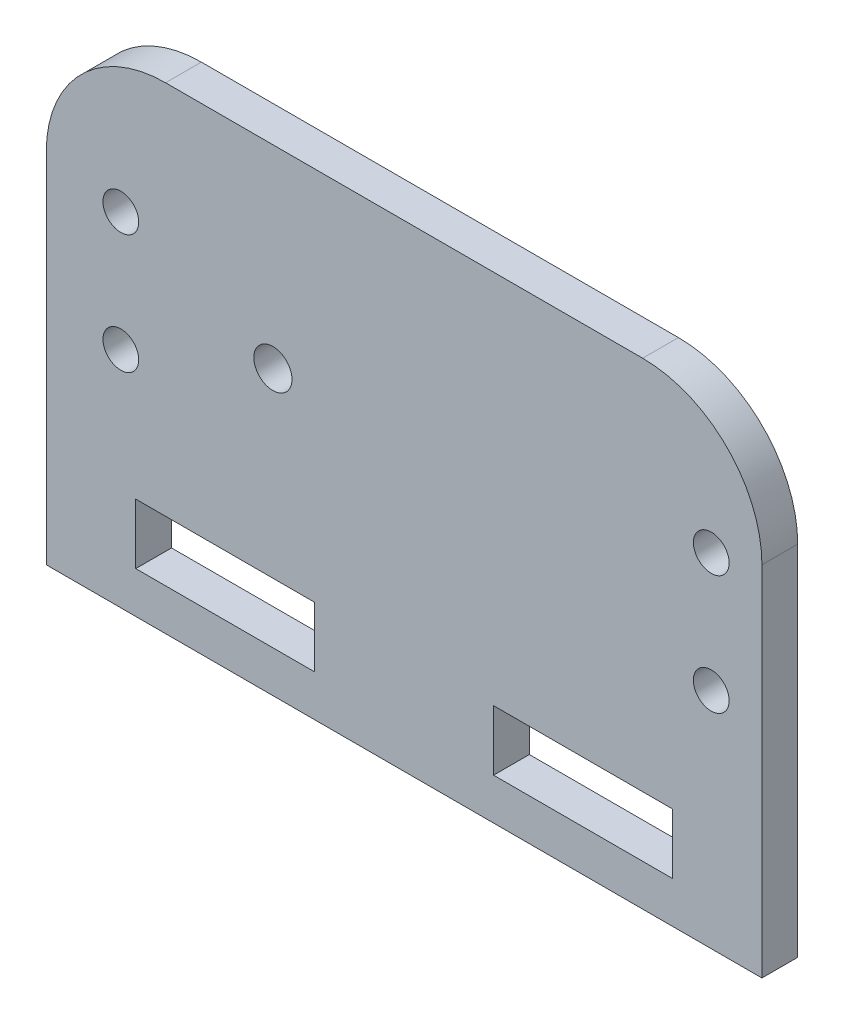
ISO-10303-21;
HEADER;
FILE_DESCRIPTION(('STEP AP214'),'2;1');
FILE_NAME('part.step','',(''),(''),'','','');
FILE_SCHEMA(('AUTOMOTIVE_DESIGN { 1 0 10303 214 1 1 1 1 }'));
ENDSEC;
DATA;
#1=APPLICATION_CONTEXT('core data for automotive mechanical design processes');
#2=APPLICATION_PROTOCOL_DEFINITION('international standard','automotive_design',2000,#1);
#3=PRODUCT_CONTEXT('',#1,'mechanical');
#4=PRODUCT('Part','Part','',(#3));
#5=PRODUCT_RELATED_PRODUCT_CATEGORY('part','',(#4));
#6=PRODUCT_DEFINITION_FORMATION('','',#4);
#7=PRODUCT_DEFINITION_CONTEXT('part definition',#1,'design');
#8=PRODUCT_DEFINITION('design','',#6,#7);
#9=PRODUCT_DEFINITION_SHAPE('','',#8);
#10=(LENGTH_UNIT() NAMED_UNIT(*) SI_UNIT(.MILLI.,.METRE.));
#11=(NAMED_UNIT(*) PLANE_ANGLE_UNIT() SI_UNIT($,.RADIAN.));
#12=(NAMED_UNIT(*) SI_UNIT($,.STERADIAN.) SOLID_ANGLE_UNIT());
#13=UNCERTAINTY_MEASURE_WITH_UNIT(LENGTH_MEASURE(1.E-05),#10,'distance_accuracy_value','');
#14=(GEOMETRIC_REPRESENTATION_CONTEXT(3) GLOBAL_UNCERTAINTY_ASSIGNED_CONTEXT((#13)) GLOBAL_UNIT_ASSIGNED_CONTEXT((#10,
#11,#12)) REPRESENTATION_CONTEXT('',''));
#15=CARTESIAN_POINT('',(0.,0.,0.));
#16=DIRECTION('',(0.,0.,1.));
#17=DIRECTION('',(1.,0.,0.));
#18=AXIS2_PLACEMENT_3D('',#15,#16,#17);
#19=CARTESIAN_POINT('',(-20.,10.,3.));
#20=DIRECTION('',(0.,0.,1.));
#21=DIRECTION('',(1.,0.,0.));
#22=AXIS2_PLACEMENT_3D('',#19,#20,#21);
#23=PLANE('',#22);
#24=CARTESIAN_POINT('',(25.75,-1.24683386193133,3.));
#25=DIRECTION('',(0.,0.,-1.));
#26=DIRECTION('',(-1.,0.,0.));
#27=AXIS2_PLACEMENT_3D('',#24,#25,#26);
#28=CIRCLE('',#27,1.5);
#29=CARTESIAN_POINT('',(24.25,-1.24683386193133,3.));
#30=VERTEX_POINT('',#29);
#31=EDGE_CURVE('E350',#30,#30,#28,.T.);
#32=ORIENTED_EDGE('',*,*,#31,.T.);
#33=EDGE_LOOP('',(#32));
#34=FACE_BOUND('',#33,.T.);
#35=CARTESIAN_POINT('',(-23.75,8.75316613806875,3.));
#36=DIRECTION('',(0.,0.,-1.));
#37=DIRECTION('',(-1.,0.,0.));
#38=AXIS2_PLACEMENT_3D('',#35,#36,#37);
#39=CIRCLE('',#38,1.5);
#40=CARTESIAN_POINT('',(-25.25,8.75316613806875,3.));
#41=VERTEX_POINT('',#40);
#42=EDGE_CURVE('E356',#41,#41,#39,.T.);
#43=ORIENTED_EDGE('',*,*,#42,.T.);
#44=EDGE_LOOP('',(#43));
#45=FACE_BOUND('',#44,.T.);
#46=CARTESIAN_POINT('',(-23.75,-1.24683386193125,3.));
#47=DIRECTION('',(0.,0.,-1.));
#48=DIRECTION('',(-1.,0.,0.));
#49=AXIS2_PLACEMENT_3D('',#46,#47,#48);
#50=CIRCLE('',#49,1.5);
#51=CARTESIAN_POINT('',(-25.25,-1.24683386193125,3.));
#52=VERTEX_POINT('',#51);
#53=EDGE_CURVE('E341',#52,#52,#50,.T.);
#54=ORIENTED_EDGE('',*,*,#53,.T.);
#55=EDGE_LOOP('',(#54));
#56=FACE_BOUND('',#55,.T.);
#57=CARTESIAN_POINT('',(25.75,8.75316613806867,3.));
#58=DIRECTION('',(0.,0.,-1.));
#59=DIRECTION('',(-1.,0.,0.));
#60=AXIS2_PLACEMENT_3D('',#57,#58,#59);
#61=CIRCLE('',#60,1.5);
#62=CARTESIAN_POINT('',(24.25,8.75316613806867,3.));
#63=VERTEX_POINT('',#62);
#64=EDGE_CURVE('E361',#63,#63,#61,.T.);
#65=ORIENTED_EDGE('',*,*,#64,.T.);
#66=EDGE_LOOP('',(#65));
#67=FACE_BOUND('',#66,.T.);
#68=CARTESIAN_POINT('',(-11.,3.7531661380687,3.));
#69=DIRECTION('',(0.,0.,1.));
#70=DIRECTION('',(1.,0.,0.));
#71=AXIS2_PLACEMENT_3D('',#68,#69,#70);
#72=CIRCLE('',#71,1.6);
#73=CARTESIAN_POINT('',(-9.40000000000001,3.7531661380687,3.));
#74=VERTEX_POINT('',#73);
#75=EDGE_CURVE('E364',#74,#74,#72,.T.);
#76=ORIENTED_EDGE('',*,*,#75,.F.);
#77=EDGE_LOOP('',(#76));
#78=FACE_BOUND('',#77,.T.);
#79=DIRECTION('',(0.,1.,0.));
#80=VECTOR('',#79,1.);
#81=CARTESIAN_POINT('',(30.,9.99999999999993,3.));
#82=LINE('',#81,#80);
#83=CARTESIAN_POINT('',(30.,-20.,3.));
#84=VERTEX_POINT('',#83);
#85=CARTESIAN_POINT('',(30.,9.99999999999994,3.));
#86=VERTEX_POINT('',#85);
#87=EDGE_CURVE('E204',#84,#86,#82,.T.);
#88=ORIENTED_EDGE('',*,*,#87,.T.);
#89=CARTESIAN_POINT('',(20.,10.,3.));
#90=DIRECTION('',(0.,0.,1.));
#91=DIRECTION('',(-1.,0.,0.));
#92=AXIS2_PLACEMENT_3D('',#89,#90,#91);
#93=CIRCLE('',#92,10.);
#94=CARTESIAN_POINT('',(19.9999999999999,20.,3.));
#95=VERTEX_POINT('',#94);
#96=EDGE_CURVE('E207',#86,#95,#93,.T.);
#97=ORIENTED_EDGE('',*,*,#96,.T.);
#98=DIRECTION('',(-1.,0.,0.));
#99=VECTOR('',#98,1.);
#100=CARTESIAN_POINT('',(-19.9999999999999,20.,3.));
#101=LINE('',#100,#99);
#102=CARTESIAN_POINT('',(-19.9999999999999,20.,3.));
#103=VERTEX_POINT('',#102);
#104=EDGE_CURVE('E210',#95,#103,#101,.T.);
#105=ORIENTED_EDGE('',*,*,#104,.T.);
#106=CARTESIAN_POINT('',(-20.,10.,3.));
#107=DIRECTION('',(0.,0.,1.));
#108=DIRECTION('',(1.,0.,0.));
#109=AXIS2_PLACEMENT_3D('',#106,#107,#108);
#110=CIRCLE('',#109,10.);
#111=CARTESIAN_POINT('',(-30.,9.99999999999993,3.));
#112=VERTEX_POINT('',#111);
#113=EDGE_CURVE('E212',#103,#112,#110,.T.);
#114=ORIENTED_EDGE('',*,*,#113,.T.);
#115=DIRECTION('',(0.,-1.,0.));
#116=VECTOR('',#115,1.);
#117=CARTESIAN_POINT('',(-30.,9.99999999999993,3.));
#118=LINE('',#117,#116);
#119=CARTESIAN_POINT('',(-30.,-20.,3.));
#120=VERTEX_POINT('',#119);
#121=EDGE_CURVE('E214',#112,#120,#118,.T.);
#122=ORIENTED_EDGE('',*,*,#121,.T.);
#123=DIRECTION('',(1.,0.,0.));
#124=VECTOR('',#123,1.);
#125=CARTESIAN_POINT('',(-30.,-20.,3.));
#126=LINE('',#125,#124);
#127=EDGE_CURVE('E216',#120,#84,#126,.T.);
#128=ORIENTED_EDGE('',*,*,#127,.T.);
#129=EDGE_LOOP('',(#88,#97,#105,#114,#122,#128));
#130=FACE_BOUND('',#129,.T.);
#131=DIRECTION('',(-1.,0.,0.));
#132=VECTOR('',#131,1.);
#133=CARTESIAN_POINT('',(22.5,-11.475,3.));
#134=LINE('',#133,#132);
#135=CARTESIAN_POINT('',(22.5,-11.475,3.));
#136=VERTEX_POINT('',#135);
#137=CARTESIAN_POINT('',(7.49999999999999,-11.475,3.));
#138=VERTEX_POINT('',#137);
#139=EDGE_CURVE('E175',#136,#138,#134,.T.);
#140=ORIENTED_EDGE('',*,*,#139,.F.);
#141=DIRECTION('',(0.,1.,0.));
#142=VECTOR('',#141,1.);
#143=CARTESIAN_POINT('',(22.5,-11.475,3.));
#144=LINE('',#143,#142);
#145=CARTESIAN_POINT('',(22.5,-16.525,3.));
#146=VERTEX_POINT('',#145);
#147=EDGE_CURVE('E173',#146,#136,#144,.T.);
#148=ORIENTED_EDGE('',*,*,#147,.F.);
#149=DIRECTION('',(1.,0.,0.));
#150=VECTOR('',#149,1.);
#151=CARTESIAN_POINT('',(22.5,-16.525,3.));
#152=LINE('',#151,#150);
#153=CARTESIAN_POINT('',(7.5,-16.525,3.));
#154=VERTEX_POINT('',#153);
#155=EDGE_CURVE('E181',#154,#146,#152,.T.);
#156=ORIENTED_EDGE('',*,*,#155,.F.);
#157=DIRECTION('',(0.,-1.,0.));
#158=VECTOR('',#157,1.);
#159=CARTESIAN_POINT('',(7.49999999999999,-11.475,3.));
#160=LINE('',#159,#158);
#161=EDGE_CURVE('E178',#138,#154,#160,.T.);
#162=ORIENTED_EDGE('',*,*,#161,.F.);
#163=EDGE_LOOP('',(#140,#148,#156,#162));
#164=FACE_BOUND('',#163,.T.);
#165=DIRECTION('',(-1.,0.,0.));
#166=VECTOR('',#165,1.);
#167=CARTESIAN_POINT('',(-22.5,-11.475,3.));
#168=LINE('',#167,#166);
#169=CARTESIAN_POINT('',(-7.49999999999999,-11.475,3.));
#170=VERTEX_POINT('',#169);
#171=CARTESIAN_POINT('',(-22.5,-11.475,3.));
#172=VERTEX_POINT('',#171);
#173=EDGE_CURVE('E143',#170,#172,#168,.T.);
#174=ORIENTED_EDGE('',*,*,#173,.F.);
#175=DIRECTION('',(0.,1.,0.));
#176=VECTOR('',#175,1.);
#177=CARTESIAN_POINT('',(-7.49999999999999,-11.475,3.));
#178=LINE('',#177,#176);
#179=CARTESIAN_POINT('',(-7.49999999999999,-16.525,3.));
#180=VERTEX_POINT('',#179);
#181=EDGE_CURVE('E135',#180,#170,#178,.T.);
#182=ORIENTED_EDGE('',*,*,#181,.F.);
#183=DIRECTION('',(1.,0.,0.));
#184=VECTOR('',#183,1.);
#185=CARTESIAN_POINT('',(-22.5,-16.525,3.));
#186=LINE('',#185,#184);
#187=CARTESIAN_POINT('',(-22.5,-16.525,3.));
#188=VERTEX_POINT('',#187);
#189=EDGE_CURVE('E157',#188,#180,#186,.T.);
#190=ORIENTED_EDGE('',*,*,#189,.F.);
#191=DIRECTION('',(0.,-1.,0.));
#192=VECTOR('',#191,1.);
#193=CARTESIAN_POINT('',(-22.5,-11.475,3.));
#194=LINE('',#193,#192);
#195=EDGE_CURVE('E155',#172,#188,#194,.T.);
#196=ORIENTED_EDGE('',*,*,#195,.F.);
#197=EDGE_LOOP('',(#174,#182,#190,#196));
#198=FACE_BOUND('',#197,.T.);
#199=ADVANCED_FACE('F34',(#34,#45,#56,#67,#78,#130,#164,#198),#23,.T.);
#200=CARTESIAN_POINT('',(-20.,10.,0.));
#201=DIRECTION('',(0.,0.,1.));
#202=DIRECTION('',(1.,0.,0.));
#203=AXIS2_PLACEMENT_3D('',#200,#201,#202);
#204=PLANE('',#203);
#205=CARTESIAN_POINT('',(25.75,-1.24683386193133,0.));
#206=DIRECTION('',(0.,0.,-1.));
#207=DIRECTION('',(-1.,0.,0.));
#208=AXIS2_PLACEMENT_3D('',#205,#206,#207);
#209=CIRCLE('',#208,1.5);
#210=CARTESIAN_POINT('',(24.25,-1.24683386193133,0.));
#211=VERTEX_POINT('',#210);
#212=EDGE_CURVE('E353',#211,#211,#209,.T.);
#213=ORIENTED_EDGE('',*,*,#212,.F.);
#214=EDGE_LOOP('',(#213));
#215=FACE_BOUND('',#214,.T.);
#216=CARTESIAN_POINT('',(-23.75,8.75316613806875,0.));
#217=DIRECTION('',(0.,0.,-1.));
#218=DIRECTION('',(-1.,0.,0.));
#219=AXIS2_PLACEMENT_3D('',#216,#217,#218);
#220=CIRCLE('',#219,1.5);
#221=CARTESIAN_POINT('',(-25.25,8.75316613806875,0.));
#222=VERTEX_POINT('',#221);
#223=EDGE_CURVE('E347',#222,#222,#220,.T.);
#224=ORIENTED_EDGE('',*,*,#223,.F.);
#225=EDGE_LOOP('',(#224));
#226=FACE_BOUND('',#225,.T.);
#227=CARTESIAN_POINT('',(-23.75,-1.24683386193125,0.));
#228=DIRECTION('',(0.,0.,-1.));
#229=DIRECTION('',(-1.,0.,0.));
#230=AXIS2_PLACEMENT_3D('',#227,#228,#229);
#231=CIRCLE('',#230,1.5);
#232=CARTESIAN_POINT('',(-25.25,-1.24683386193125,0.));
#233=VERTEX_POINT('',#232);
#234=EDGE_CURVE('E344',#233,#233,#231,.T.);
#235=ORIENTED_EDGE('',*,*,#234,.F.);
#236=EDGE_LOOP('',(#235));
#237=FACE_BOUND('',#236,.T.);
#238=CARTESIAN_POINT('',(25.75,8.75316613806867,0.));
#239=DIRECTION('',(0.,0.,-1.));
#240=DIRECTION('',(-1.,0.,0.));
#241=AXIS2_PLACEMENT_3D('',#238,#239,#240);
#242=CIRCLE('',#241,1.5);
#243=CARTESIAN_POINT('',(24.25,8.75316613806867,0.));
#244=VERTEX_POINT('',#243);
#245=EDGE_CURVE('E352',#244,#244,#242,.T.);
#246=ORIENTED_EDGE('',*,*,#245,.F.);
#247=EDGE_LOOP('',(#246));
#248=FACE_BOUND('',#247,.T.);
#249=CARTESIAN_POINT('',(-11.,3.7531661380687,0.));
#250=DIRECTION('',(0.,0.,1.));
#251=DIRECTION('',(1.,0.,0.));
#252=AXIS2_PLACEMENT_3D('',#249,#250,#251);
#253=CIRCLE('',#252,1.6);
#254=CARTESIAN_POINT('',(-9.40000000000001,3.7531661380687,0.));
#255=VERTEX_POINT('',#254);
#256=EDGE_CURVE('E163',#255,#255,#253,.T.);
#257=ORIENTED_EDGE('',*,*,#256,.T.);
#258=EDGE_LOOP('',(#257));
#259=FACE_BOUND('',#258,.T.);
#260=DIRECTION('',(0.,1.,0.));
#261=VECTOR('',#260,1.);
#262=CARTESIAN_POINT('',(22.5,-11.475,0.));
#263=LINE('',#262,#261);
#264=CARTESIAN_POINT('',(22.5,-16.525,0.));
#265=VERTEX_POINT('',#264);
#266=CARTESIAN_POINT('',(22.5,-11.475,0.));
#267=VERTEX_POINT('',#266);
#268=EDGE_CURVE('E151',#265,#267,#263,.T.);
#269=ORIENTED_EDGE('',*,*,#268,.T.);
#270=DIRECTION('',(-1.,0.,0.));
#271=VECTOR('',#270,1.);
#272=CARTESIAN_POINT('',(22.5,-11.475,0.));
#273=LINE('',#272,#271);
#274=CARTESIAN_POINT('',(7.49999999999999,-11.475,0.));
#275=VERTEX_POINT('',#274);
#276=EDGE_CURVE('E186',#267,#275,#273,.T.);
#277=ORIENTED_EDGE('',*,*,#276,.T.);
#278=DIRECTION('',(0.,-1.,0.));
#279=VECTOR('',#278,1.);
#280=CARTESIAN_POINT('',(7.49999999999999,-11.475,0.));
#281=LINE('',#280,#279);
#282=CARTESIAN_POINT('',(7.5,-16.525,0.));
#283=VERTEX_POINT('',#282);
#284=EDGE_CURVE('E189',#275,#283,#281,.T.);
#285=ORIENTED_EDGE('',*,*,#284,.T.);
#286=DIRECTION('',(1.,0.,0.));
#287=VECTOR('',#286,1.);
#288=CARTESIAN_POINT('',(22.5,-16.525,0.));
#289=LINE('',#288,#287);
#290=EDGE_CURVE('E176',#283,#265,#289,.T.);
#291=ORIENTED_EDGE('',*,*,#290,.T.);
#292=EDGE_LOOP('',(#269,#277,#285,#291));
#293=FACE_BOUND('',#292,.T.);
#294=DIRECTION('',(0.,1.,0.));
#295=VECTOR('',#294,1.);
#296=CARTESIAN_POINT('',(30.,9.99999999999993,0.));
#297=LINE('',#296,#295);
#298=CARTESIAN_POINT('',(30.,-20.,0.));
#299=VERTEX_POINT('',#298);
#300=CARTESIAN_POINT('',(30.,9.99999999999994,0.));
#301=VERTEX_POINT('',#300);
#302=EDGE_CURVE('E203',#299,#301,#297,.T.);
#303=ORIENTED_EDGE('',*,*,#302,.F.);
#304=DIRECTION('',(1.,0.,0.));
#305=VECTOR('',#304,1.);
#306=CARTESIAN_POINT('',(-30.,-20.,0.));
#307=LINE('',#306,#305);
#308=CARTESIAN_POINT('',(-30.,-20.,0.));
#309=VERTEX_POINT('',#308);
#310=EDGE_CURVE('E208',#309,#299,#307,.T.);
#311=ORIENTED_EDGE('',*,*,#310,.F.);
#312=DIRECTION('',(0.,-1.,0.));
#313=VECTOR('',#312,1.);
#314=CARTESIAN_POINT('',(-30.,9.99999999999993,0.));
#315=LINE('',#314,#313);
#316=CARTESIAN_POINT('',(-30.,9.99999999999993,0.));
#317=VERTEX_POINT('',#316);
#318=EDGE_CURVE('E227',#317,#309,#315,.T.);
#319=ORIENTED_EDGE('',*,*,#318,.F.);
#320=CARTESIAN_POINT('',(-20.,10.,0.));
#321=DIRECTION('',(0.,0.,1.));
#322=DIRECTION('',(1.,0.,0.));
#323=AXIS2_PLACEMENT_3D('',#320,#321,#322);
#324=CIRCLE('',#323,10.);
#325=CARTESIAN_POINT('',(-19.9999999999999,20.,0.));
#326=VERTEX_POINT('',#325);
#327=EDGE_CURVE('E225',#326,#317,#324,.T.);
#328=ORIENTED_EDGE('',*,*,#327,.F.);
#329=DIRECTION('',(-1.,0.,0.));
#330=VECTOR('',#329,1.);
#331=CARTESIAN_POINT('',(-19.9999999999999,20.,0.));
#332=LINE('',#331,#330);
#333=CARTESIAN_POINT('',(19.9999999999999,20.,0.));
#334=VERTEX_POINT('',#333);
#335=EDGE_CURVE('E223',#334,#326,#332,.T.);
#336=ORIENTED_EDGE('',*,*,#335,.F.);
#337=CARTESIAN_POINT('',(20.,10.,0.));
#338=DIRECTION('',(0.,0.,1.));
#339=DIRECTION('',(-1.,0.,0.));
#340=AXIS2_PLACEMENT_3D('',#337,#338,#339);
#341=CIRCLE('',#340,10.);
#342=EDGE_CURVE('E221',#301,#334,#341,.T.);
#343=ORIENTED_EDGE('',*,*,#342,.F.);
#344=EDGE_LOOP('',(#303,#311,#319,#328,#336,#343));
#345=FACE_BOUND('',#344,.T.);
#346=DIRECTION('',(0.,1.,0.));
#347=VECTOR('',#346,1.);
#348=CARTESIAN_POINT('',(-7.49999999999999,-11.475,0.));
#349=LINE('',#348,#347);
#350=CARTESIAN_POINT('',(-7.49999999999999,-16.525,0.));
#351=VERTEX_POINT('',#350);
#352=CARTESIAN_POINT('',(-7.49999999999999,-11.475,0.));
#353=VERTEX_POINT('',#352);
#354=EDGE_CURVE('E57',#351,#353,#349,.T.);
#355=ORIENTED_EDGE('',*,*,#354,.T.);
#356=DIRECTION('',(-1.,0.,0.));
#357=VECTOR('',#356,1.);
#358=CARTESIAN_POINT('',(-22.5,-11.475,0.));
#359=LINE('',#358,#357);
#360=CARTESIAN_POINT('',(-22.5,-11.475,0.));
#361=VERTEX_POINT('',#360);
#362=EDGE_CURVE('E150',#353,#361,#359,.T.);
#363=ORIENTED_EDGE('',*,*,#362,.T.);
#364=DIRECTION('',(0.,-1.,0.));
#365=VECTOR('',#364,1.);
#366=CARTESIAN_POINT('',(-22.5,-11.475,0.));
#367=LINE('',#366,#365);
#368=CARTESIAN_POINT('',(-22.5,-16.525,0.));
#369=VERTEX_POINT('',#368);
#370=EDGE_CURVE('E165',#361,#369,#367,.T.);
#371=ORIENTED_EDGE('',*,*,#370,.T.);
#372=DIRECTION('',(1.,0.,0.));
#373=VECTOR('',#372,1.);
#374=CARTESIAN_POINT('',(-22.5,-16.525,0.));
#375=LINE('',#374,#373);
#376=EDGE_CURVE('E144',#369,#351,#375,.T.);
#377=ORIENTED_EDGE('',*,*,#376,.T.);
#378=EDGE_LOOP('',(#355,#363,#371,#377));
#379=FACE_BOUND('',#378,.T.);
#380=ADVANCED_FACE('F251',(#215,#226,#237,#248,#259,#293,#345,#379),#204,.F.);
#381=CARTESIAN_POINT('',(30.,9.99999999999993,3.));
#382=DIRECTION('',(-1.,0.,0.));
#383=DIRECTION('',(0.,-1.,0.));
#384=AXIS2_PLACEMENT_3D('',#381,#382,#383);
#385=PLANE('',#384);
#386=ORIENTED_EDGE('',*,*,#302,.T.);
#387=DIRECTION('',(0.,0.,-1.));
#388=VECTOR('',#387,1.);
#389=CARTESIAN_POINT('',(30.,9.99999999999994,3.));
#390=LINE('',#389,#388);
#391=EDGE_CURVE('E11',#86,#301,#390,.T.);
#392=ORIENTED_EDGE('',*,*,#391,.F.);
#393=ORIENTED_EDGE('',*,*,#87,.F.);
#394=DIRECTION('',(0.,0.,-1.));
#395=VECTOR('',#394,1.);
#396=CARTESIAN_POINT('',(30.,-20.,3.));
#397=LINE('',#396,#395);
#398=EDGE_CURVE('E218',#84,#299,#397,.T.);
#399=ORIENTED_EDGE('',*,*,#398,.T.);
#400=EDGE_LOOP('',(#386,#392,#393,#399));
#401=FACE_BOUND('',#400,.T.);
#402=ADVANCED_FACE('F36',(#401),#385,.F.);
#403=CARTESIAN_POINT('',(20.,10.,3.));
#404=DIRECTION('',(0.,0.,-1.));
#405=DIRECTION('',(-1.,0.,0.));
#406=AXIS2_PLACEMENT_3D('',#403,#404,#405);
#407=CYLINDRICAL_SURFACE('',#406,10.);
#408=ORIENTED_EDGE('',*,*,#342,.T.);
#409=DIRECTION('',(0.,0.,-1.));
#410=VECTOR('',#409,1.);
#411=CARTESIAN_POINT('',(19.9999999999999,20.,3.));
#412=LINE('',#411,#410);
#413=EDGE_CURVE('E42',#95,#334,#412,.T.);
#414=ORIENTED_EDGE('',*,*,#413,.F.);
#415=ORIENTED_EDGE('',*,*,#96,.F.);
#416=ORIENTED_EDGE('',*,*,#391,.T.);
#417=EDGE_LOOP('',(#408,#414,#415,#416));
#418=FACE_BOUND('',#417,.T.);
#419=ADVANCED_FACE('F269',(#418),#407,.T.);
#420=CARTESIAN_POINT('',(-19.9999999999999,20.,3.));
#421=DIRECTION('',(0.,-1.,0.));
#422=DIRECTION('',(0.,0.,-1.));
#423=AXIS2_PLACEMENT_3D('',#420,#421,#422);
#424=PLANE('',#423);
#425=ORIENTED_EDGE('',*,*,#335,.T.);
#426=DIRECTION('',(0.,0.,-1.));
#427=VECTOR('',#426,1.);
#428=CARTESIAN_POINT('',(-19.9999999999999,20.,3.));
#429=LINE('',#428,#427);
#430=EDGE_CURVE('E238',#103,#326,#429,.T.);
#431=ORIENTED_EDGE('',*,*,#430,.F.);
#432=ORIENTED_EDGE('',*,*,#104,.F.);
#433=ORIENTED_EDGE('',*,*,#413,.T.);
#434=EDGE_LOOP('',(#425,#431,#432,#433));
#435=FACE_BOUND('',#434,.T.);
#436=ADVANCED_FACE('F245',(#435),#424,.F.);
#437=CARTESIAN_POINT('',(-20.,10.,3.));
#438=DIRECTION('',(0.,0.,-1.));
#439=DIRECTION('',(-1.,0.,0.));
#440=AXIS2_PLACEMENT_3D('',#437,#438,#439);
#441=CYLINDRICAL_SURFACE('',#440,10.);
#442=ORIENTED_EDGE('',*,*,#327,.T.);
#443=DIRECTION('',(0.,0.,-1.));
#444=VECTOR('',#443,1.);
#445=CARTESIAN_POINT('',(-30.,9.99999999999993,3.));
#446=LINE('',#445,#444);
#447=EDGE_CURVE('E235',#112,#317,#446,.T.);
#448=ORIENTED_EDGE('',*,*,#447,.F.);
#449=ORIENTED_EDGE('',*,*,#113,.F.);
#450=ORIENTED_EDGE('',*,*,#430,.T.);
#451=EDGE_LOOP('',(#442,#448,#449,#450));
#452=FACE_BOUND('',#451,.T.);
#453=ADVANCED_FACE('F257',(#452),#441,.T.);
#454=CARTESIAN_POINT('',(-30.,9.99999999999993,3.));
#455=DIRECTION('',(1.,0.,0.));
#456=DIRECTION('',(0.,1.,0.));
#457=AXIS2_PLACEMENT_3D('',#454,#455,#456);
#458=PLANE('',#457);
#459=ORIENTED_EDGE('',*,*,#318,.T.);
#460=DIRECTION('',(0.,0.,-1.));
#461=VECTOR('',#460,1.);
#462=CARTESIAN_POINT('',(-30.,-20.,3.));
#463=LINE('',#462,#461);
#464=EDGE_CURVE('E232',#120,#309,#463,.T.);
#465=ORIENTED_EDGE('',*,*,#464,.F.);
#466=ORIENTED_EDGE('',*,*,#121,.F.);
#467=ORIENTED_EDGE('',*,*,#447,.T.);
#468=EDGE_LOOP('',(#459,#465,#466,#467));
#469=FACE_BOUND('',#468,.T.);
#470=ADVANCED_FACE('F261',(#469),#458,.F.);
#471=CARTESIAN_POINT('',(-30.,-20.,3.));
#472=DIRECTION('',(0.,1.,0.));
#473=DIRECTION('',(0.,0.,1.));
#474=AXIS2_PLACEMENT_3D('',#471,#472,#473);
#475=PLANE('',#474);
#476=ORIENTED_EDGE('',*,*,#310,.T.);
#477=ORIENTED_EDGE('',*,*,#398,.F.);
#478=ORIENTED_EDGE('',*,*,#127,.F.);
#479=ORIENTED_EDGE('',*,*,#464,.T.);
#480=EDGE_LOOP('',(#476,#477,#478,#479));
#481=FACE_BOUND('',#480,.T.);
#482=ADVANCED_FACE('F272',(#481),#475,.F.);
#483=CARTESIAN_POINT('',(22.5,-11.475,3.));
#484=DIRECTION('',(-1.,0.,0.));
#485=DIRECTION('',(0.,-1.,0.));
#486=AXIS2_PLACEMENT_3D('',#483,#484,#485);
#487=PLANE('',#486);
#488=ORIENTED_EDGE('',*,*,#268,.F.);
#489=DIRECTION('',(0.,0.,-1.));
#490=VECTOR('',#489,1.);
#491=CARTESIAN_POINT('',(22.5,-16.525,3.));
#492=LINE('',#491,#490);
#493=EDGE_CURVE('E183',#146,#265,#492,.T.);
#494=ORIENTED_EDGE('',*,*,#493,.F.);
#495=ORIENTED_EDGE('',*,*,#147,.T.);
#496=DIRECTION('',(0.,0.,-1.));
#497=VECTOR('',#496,1.);
#498=CARTESIAN_POINT('',(22.5,-11.475,3.));
#499=LINE('',#498,#497);
#500=EDGE_CURVE('E200',#136,#267,#499,.T.);
#501=ORIENTED_EDGE('',*,*,#500,.T.);
#502=EDGE_LOOP('',(#488,#494,#495,#501));
#503=FACE_BOUND('',#502,.T.);
#504=ADVANCED_FACE('F274',(#503),#487,.T.);
#505=CARTESIAN_POINT('',(22.5,-11.475,3.));
#506=DIRECTION('',(0.,-1.,0.));
#507=DIRECTION('',(1.,0.,0.));
#508=AXIS2_PLACEMENT_3D('',#505,#506,#507);
#509=PLANE('',#508);
#510=ORIENTED_EDGE('',*,*,#276,.F.);
#511=ORIENTED_EDGE('',*,*,#500,.F.);
#512=ORIENTED_EDGE('',*,*,#139,.T.);
#513=DIRECTION('',(0.,0.,-1.));
#514=VECTOR('',#513,1.);
#515=CARTESIAN_POINT('',(7.49999999999999,-11.475,3.));
#516=LINE('',#515,#514);
#517=EDGE_CURVE('E198',#138,#275,#516,.T.);
#518=ORIENTED_EDGE('',*,*,#517,.T.);
#519=EDGE_LOOP('',(#510,#511,#512,#518));
#520=FACE_BOUND('',#519,.T.);
#521=ADVANCED_FACE('F280',(#520),#509,.T.);
#522=CARTESIAN_POINT('',(7.49999999999999,-11.475,3.));
#523=DIRECTION('',(1.,0.,0.));
#524=DIRECTION('',(0.,1.,0.));
#525=AXIS2_PLACEMENT_3D('',#522,#523,#524);
#526=PLANE('',#525);
#527=ORIENTED_EDGE('',*,*,#284,.F.);
#528=ORIENTED_EDGE('',*,*,#517,.F.);
#529=ORIENTED_EDGE('',*,*,#161,.T.);
#530=DIRECTION('',(0.,0.,-1.));
#531=VECTOR('',#530,1.);
#532=CARTESIAN_POINT('',(7.5,-16.525,3.));
#533=LINE('',#532,#531);
#534=EDGE_CURVE('E196',#154,#283,#533,.T.);
#535=ORIENTED_EDGE('',*,*,#534,.T.);
#536=EDGE_LOOP('',(#527,#528,#529,#535));
#537=FACE_BOUND('',#536,.T.);
#538=ADVANCED_FACE('F297',(#537),#526,.T.);
#539=CARTESIAN_POINT('',(22.5,-16.525,3.));
#540=DIRECTION('',(0.,1.,0.));
#541=DIRECTION('',(-1.,0.,0.));
#542=AXIS2_PLACEMENT_3D('',#539,#540,#541);
#543=PLANE('',#542);
#544=ORIENTED_EDGE('',*,*,#290,.F.);
#545=ORIENTED_EDGE('',*,*,#534,.F.);
#546=ORIENTED_EDGE('',*,*,#155,.T.);
#547=ORIENTED_EDGE('',*,*,#493,.T.);
#548=EDGE_LOOP('',(#544,#545,#546,#547));
#549=FACE_BOUND('',#548,.T.);
#550=ADVANCED_FACE('F301',(#549),#543,.T.);
#551=CARTESIAN_POINT('',(-7.49999999999999,-11.475,3.));
#552=DIRECTION('',(-1.,0.,0.));
#553=DIRECTION('',(0.,0.,1.));
#554=AXIS2_PLACEMENT_3D('',#551,#552,#553);
#555=PLANE('',#554);
#556=ORIENTED_EDGE('',*,*,#354,.F.);
#557=DIRECTION('',(0.,0.,-1.));
#558=VECTOR('',#557,1.);
#559=CARTESIAN_POINT('',(-7.49999999999999,-16.525,3.));
#560=LINE('',#559,#558);
#561=EDGE_CURVE('E139',#180,#351,#560,.T.);
#562=ORIENTED_EDGE('',*,*,#561,.F.);
#563=ORIENTED_EDGE('',*,*,#181,.T.);
#564=DIRECTION('',(0.,0.,-1.));
#565=VECTOR('',#564,1.);
#566=CARTESIAN_POINT('',(-7.49999999999999,-11.475,3.));
#567=LINE('',#566,#565);
#568=EDGE_CURVE('E138',#170,#353,#567,.T.);
#569=ORIENTED_EDGE('',*,*,#568,.T.);
#570=EDGE_LOOP('',(#556,#562,#563,#569));
#571=FACE_BOUND('',#570,.T.);
#572=ADVANCED_FACE('F137',(#571),#555,.T.);
#573=CARTESIAN_POINT('',(-22.5,-11.475,3.));
#574=DIRECTION('',(0.,-1.,0.));
#575=DIRECTION('',(0.,0.,-1.));
#576=AXIS2_PLACEMENT_3D('',#573,#574,#575);
#577=PLANE('',#576);
#578=ORIENTED_EDGE('',*,*,#362,.F.);
#579=ORIENTED_EDGE('',*,*,#568,.F.);
#580=ORIENTED_EDGE('',*,*,#173,.T.);
#581=DIRECTION('',(0.,0.,-1.));
#582=VECTOR('',#581,1.);
#583=CARTESIAN_POINT('',(-22.5,-11.475,3.));
#584=LINE('',#583,#582);
#585=EDGE_CURVE('E152',#172,#361,#584,.T.);
#586=ORIENTED_EDGE('',*,*,#585,.T.);
#587=EDGE_LOOP('',(#578,#579,#580,#586));
#588=FACE_BOUND('',#587,.T.);
#589=ADVANCED_FACE('F147',(#588),#577,.T.);
#590=CARTESIAN_POINT('',(-22.5,-11.475,3.));
#591=DIRECTION('',(1.,0.,0.));
#592=DIRECTION('',(0.,1.,0.));
#593=AXIS2_PLACEMENT_3D('',#590,#591,#592);
#594=PLANE('',#593);
#595=ORIENTED_EDGE('',*,*,#370,.F.);
#596=ORIENTED_EDGE('',*,*,#585,.F.);
#597=ORIENTED_EDGE('',*,*,#195,.T.);
#598=DIRECTION('',(0.,0.,-1.));
#599=VECTOR('',#598,1.);
#600=CARTESIAN_POINT('',(-22.5,-16.525,3.));
#601=LINE('',#600,#599);
#602=EDGE_CURVE('E49',#188,#369,#601,.T.);
#603=ORIENTED_EDGE('',*,*,#602,.T.);
#604=EDGE_LOOP('',(#595,#596,#597,#603));
#605=FACE_BOUND('',#604,.T.);
#606=ADVANCED_FACE('F310',(#605),#594,.T.);
#607=CARTESIAN_POINT('',(-22.5,-16.525,3.));
#608=DIRECTION('',(0.,1.,0.));
#609=DIRECTION('',(0.,0.,1.));
#610=AXIS2_PLACEMENT_3D('',#607,#608,#609);
#611=PLANE('',#610);
#612=ORIENTED_EDGE('',*,*,#376,.F.);
#613=ORIENTED_EDGE('',*,*,#602,.F.);
#614=ORIENTED_EDGE('',*,*,#189,.T.);
#615=ORIENTED_EDGE('',*,*,#561,.T.);
#616=EDGE_LOOP('',(#612,#613,#614,#615));
#617=FACE_BOUND('',#616,.T.);
#618=ADVANCED_FACE('F313',(#617),#611,.T.);
#619=CARTESIAN_POINT('',(-11.,3.7531661380687,0.));
#620=DIRECTION('',(0.,0.,1.));
#621=DIRECTION('',(1.,0.,0.));
#622=AXIS2_PLACEMENT_3D('',#619,#620,#621);
#623=CYLINDRICAL_SURFACE('',#622,1.6);
#624=ORIENTED_EDGE('',*,*,#256,.F.);
#625=EDGE_LOOP('',(#624));
#626=FACE_BOUND('',#625,.T.);
#627=ORIENTED_EDGE('',*,*,#75,.T.);
#628=EDGE_LOOP('',(#627));
#629=FACE_BOUND('',#628,.T.);
#630=ADVANCED_FACE('F317',(#626,#629),#623,.F.);
#631=CARTESIAN_POINT('',(25.75,8.75316613806867,3.));
#632=DIRECTION('',(0.,0.,-1.));
#633=DIRECTION('',(-1.,0.,0.));
#634=AXIS2_PLACEMENT_3D('',#631,#632,#633);
#635=CYLINDRICAL_SURFACE('',#634,1.5);
#636=ORIENTED_EDGE('',*,*,#64,.F.);
#637=EDGE_LOOP('',(#636));
#638=FACE_BOUND('',#637,.T.);
#639=ORIENTED_EDGE('',*,*,#245,.T.);
#640=EDGE_LOOP('',(#639));
#641=FACE_BOUND('',#640,.T.);
#642=ADVANCED_FACE('F320',(#638,#641),#635,.F.);
#643=CARTESIAN_POINT('',(-23.75,-1.24683386193125,3.));
#644=DIRECTION('',(0.,0.,-1.));
#645=DIRECTION('',(-1.,0.,0.));
#646=AXIS2_PLACEMENT_3D('',#643,#644,#645);
#647=CYLINDRICAL_SURFACE('',#646,1.5);
#648=ORIENTED_EDGE('',*,*,#53,.F.);
#649=EDGE_LOOP('',(#648));
#650=FACE_BOUND('',#649,.T.);
#651=ORIENTED_EDGE('',*,*,#234,.T.);
#652=EDGE_LOOP('',(#651));
#653=FACE_BOUND('',#652,.T.);
#654=ADVANCED_FACE('F324',(#650,#653),#647,.F.);
#655=CARTESIAN_POINT('',(-23.75,8.75316613806875,3.));
#656=DIRECTION('',(0.,0.,-1.));
#657=DIRECTION('',(-1.,0.,0.));
#658=AXIS2_PLACEMENT_3D('',#655,#656,#657);
#659=CYLINDRICAL_SURFACE('',#658,1.5);
#660=ORIENTED_EDGE('',*,*,#42,.F.);
#661=EDGE_LOOP('',(#660));
#662=FACE_BOUND('',#661,.T.);
#663=ORIENTED_EDGE('',*,*,#223,.T.);
#664=EDGE_LOOP('',(#663));
#665=FACE_BOUND('',#664,.T.);
#666=ADVANCED_FACE('F326',(#662,#665),#659,.F.);
#667=CARTESIAN_POINT('',(25.75,-1.24683386193133,3.));
#668=DIRECTION('',(0.,0.,-1.));
#669=DIRECTION('',(-1.,0.,0.));
#670=AXIS2_PLACEMENT_3D('',#667,#668,#669);
#671=CYLINDRICAL_SURFACE('',#670,1.5);
#672=ORIENTED_EDGE('',*,*,#31,.F.);
#673=EDGE_LOOP('',(#672));
#674=FACE_BOUND('',#673,.T.);
#675=ORIENTED_EDGE('',*,*,#212,.T.);
#676=EDGE_LOOP('',(#675));
#677=FACE_BOUND('',#676,.T.);
#678=ADVANCED_FACE('F329',(#674,#677),#671,.F.);
#679=CLOSED_SHELL('',(#199,#380,#402,#419,#436,#453,#470,#482,#504,#521,#538,#550,#572,#589,
#606,#618,#630,#642,#654,#666,#678));
#680=MANIFOLD_SOLID_BREP('B2',#679);
#681=ADVANCED_BREP_SHAPE_REPRESENTATION('',(#18,#680),#14);
#682=SHAPE_DEFINITION_REPRESENTATION(#9,#681);
ENDSEC;
END-ISO-10303-21;
